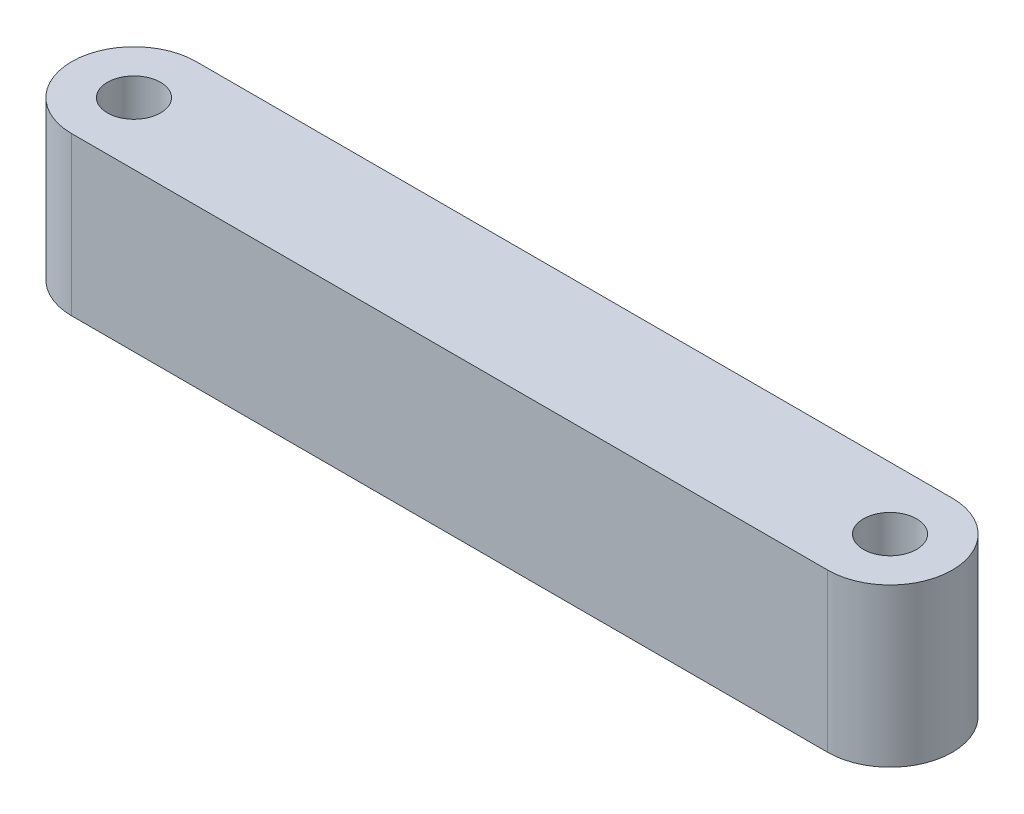
ISO-10303-21;
HEADER;
FILE_DESCRIPTION(('STEP AP214'),'2;1');
FILE_NAME('part.step','',(''),(''),'','','');
FILE_SCHEMA(('AUTOMOTIVE_DESIGN { 1 0 10303 214 1 1 1 1 }'));
ENDSEC;
DATA;
#1=APPLICATION_CONTEXT('core data for automotive mechanical design processes');
#2=APPLICATION_PROTOCOL_DEFINITION('international standard','automotive_design',2000,#1);
#3=PRODUCT_CONTEXT('',#1,'mechanical');
#4=PRODUCT('Part','Part','',(#3));
#5=PRODUCT_RELATED_PRODUCT_CATEGORY('part','',(#4));
#6=PRODUCT_DEFINITION_FORMATION('','',#4);
#7=PRODUCT_DEFINITION_CONTEXT('part definition',#1,'design');
#8=PRODUCT_DEFINITION('design','',#6,#7);
#9=PRODUCT_DEFINITION_SHAPE('','',#8);
#10=(LENGTH_UNIT() NAMED_UNIT(*) SI_UNIT(.MILLI.,.METRE.));
#11=(NAMED_UNIT(*) PLANE_ANGLE_UNIT() SI_UNIT($,.RADIAN.));
#12=(NAMED_UNIT(*) SI_UNIT($,.STERADIAN.) SOLID_ANGLE_UNIT());
#13=UNCERTAINTY_MEASURE_WITH_UNIT(LENGTH_MEASURE(1.E-05),#10,'distance_accuracy_value','');
#14=(GEOMETRIC_REPRESENTATION_CONTEXT(3) GLOBAL_UNCERTAINTY_ASSIGNED_CONTEXT((#13)) GLOBAL_UNIT_ASSIGNED_CONTEXT((#10,
#11,#12)) REPRESENTATION_CONTEXT('',''));
#15=CARTESIAN_POINT('',(0.,0.,0.));
#16=DIRECTION('',(0.,0.,1.));
#17=DIRECTION('',(1.,0.,0.));
#18=AXIS2_PLACEMENT_3D('',#15,#16,#17);
#19=CARTESIAN_POINT('',(-22.75,0.,0.));
#20=DIRECTION('',(0.,-1.,0.));
#21=DIRECTION('',(0.,0.,-1.));
#22=AXIS2_PLACEMENT_3D('',#19,#20,#21);
#23=CYLINDRICAL_SURFACE('',#22,3.75);
#24=DIRECTION('',(0.,-1.,0.));
#25=VECTOR('',#24,1.);
#26=CARTESIAN_POINT('',(-22.75,9.5,-3.75));
#27=LINE('',#26,#25);
#28=CARTESIAN_POINT('',(-22.75,0.,-3.75));
#29=VERTEX_POINT('',#28);
#30=CARTESIAN_POINT('',(-22.75,9.5,-3.75));
#31=VERTEX_POINT('',#30);
#32=EDGE_CURVE('E95',#29,#31,#27,.F.);
#33=ORIENTED_EDGE('',*,*,#32,.F.);
#34=CARTESIAN_POINT('',(-22.75,0.,0.));
#35=DIRECTION('',(0.,-1.,0.));
#36=DIRECTION('',(0.,0.,-1.));
#37=AXIS2_PLACEMENT_3D('',#34,#35,#36);
#38=CIRCLE('',#37,3.75);
#39=CARTESIAN_POINT('',(-22.75,0.,3.75));
#40=VERTEX_POINT('',#39);
#41=EDGE_CURVE('E52',#40,#29,#38,.T.);
#42=ORIENTED_EDGE('',*,*,#41,.F.);
#43=DIRECTION('',(0.,-1.,0.));
#44=VECTOR('',#43,1.);
#45=CARTESIAN_POINT('',(-22.75,9.5,3.75));
#46=LINE('',#45,#44);
#47=CARTESIAN_POINT('',(-22.75,9.5,3.75));
#48=VERTEX_POINT('',#47);
#49=EDGE_CURVE('E127',#48,#40,#46,.T.);
#50=ORIENTED_EDGE('',*,*,#49,.F.);
#51=CARTESIAN_POINT('',(-22.75,9.5,0.));
#52=DIRECTION('',(0.,-1.,0.));
#53=DIRECTION('',(0.,0.,-1.));
#54=AXIS2_PLACEMENT_3D('',#51,#52,#53);
#55=CIRCLE('',#54,3.75);
#56=EDGE_CURVE('E11',#31,#48,#55,.F.);
#57=ORIENTED_EDGE('',*,*,#56,.F.);
#58=EDGE_LOOP('',(#33,#42,#50,#57));
#59=FACE_BOUND('',#58,.T.);
#60=ADVANCED_FACE('F43',(#59),#23,.T.);
#61=CARTESIAN_POINT('',(22.75,9.5,0.));
#62=DIRECTION('',(0.,-1.,0.));
#63=DIRECTION('',(0.,0.,-1.));
#64=AXIS2_PLACEMENT_3D('',#61,#62,#63);
#65=CYLINDRICAL_SURFACE('',#64,3.75);
#66=DIRECTION('',(0.,-1.,0.));
#67=VECTOR('',#66,1.);
#68=CARTESIAN_POINT('',(22.75,9.5,-3.75));
#69=LINE('',#68,#67);
#70=CARTESIAN_POINT('',(22.75,9.5,-3.75));
#71=VERTEX_POINT('',#70);
#72=CARTESIAN_POINT('',(22.75,0.,-3.75));
#73=VERTEX_POINT('',#72);
#74=EDGE_CURVE('E87',#71,#73,#69,.T.);
#75=ORIENTED_EDGE('',*,*,#74,.F.);
#76=CARTESIAN_POINT('',(22.75,9.5,0.));
#77=DIRECTION('',(0.,-1.,0.));
#78=DIRECTION('',(0.,0.,-1.));
#79=AXIS2_PLACEMENT_3D('',#76,#77,#78);
#80=CIRCLE('',#79,3.75);
#81=CARTESIAN_POINT('',(22.75,9.5,3.75));
#82=VERTEX_POINT('',#81);
#83=EDGE_CURVE('E96',#82,#71,#80,.F.);
#84=ORIENTED_EDGE('',*,*,#83,.F.);
#85=DIRECTION('',(0.,-1.,0.));
#86=VECTOR('',#85,1.);
#87=CARTESIAN_POINT('',(22.75,9.5,3.75));
#88=LINE('',#87,#86);
#89=CARTESIAN_POINT('',(22.75,0.,3.75));
#90=VERTEX_POINT('',#89);
#91=EDGE_CURVE('E90',#90,#82,#88,.F.);
#92=ORIENTED_EDGE('',*,*,#91,.F.);
#93=CARTESIAN_POINT('',(22.75,0.,0.));
#94=DIRECTION('',(0.,-1.,0.));
#95=DIRECTION('',(0.,0.,-1.));
#96=AXIS2_PLACEMENT_3D('',#93,#94,#95);
#97=CIRCLE('',#96,3.75);
#98=EDGE_CURVE('E83',#73,#90,#97,.T.);
#99=ORIENTED_EDGE('',*,*,#98,.F.);
#100=EDGE_LOOP('',(#75,#84,#92,#99));
#101=FACE_BOUND('',#100,.T.);
#102=ADVANCED_FACE('F85',(#101),#65,.T.);
#103=CARTESIAN_POINT('',(-26.5,9.5,-3.75));
#104=DIRECTION('',(0.,0.,1.));
#105=DIRECTION('',(1.,0.,0.));
#106=AXIS2_PLACEMENT_3D('',#103,#104,#105);
#107=PLANE('',#106);
#108=DIRECTION('',(-1.,0.,0.));
#109=VECTOR('',#108,1.);
#110=CARTESIAN_POINT('',(-26.5,0.,-3.75));
#111=LINE('',#110,#109);
#112=EDGE_CURVE('E102',#73,#29,#111,.T.);
#113=ORIENTED_EDGE('',*,*,#112,.T.);
#114=ORIENTED_EDGE('',*,*,#32,.T.);
#115=DIRECTION('',(-1.,0.,0.));
#116=VECTOR('',#115,1.);
#117=CARTESIAN_POINT('',(-26.5,9.5,-3.75));
#118=LINE('',#117,#116);
#119=EDGE_CURVE('E103',#71,#31,#118,.T.);
#120=ORIENTED_EDGE('',*,*,#119,.F.);
#121=ORIENTED_EDGE('',*,*,#74,.T.);
#122=EDGE_LOOP('',(#113,#114,#120,#121));
#123=FACE_BOUND('',#122,.T.);
#124=ADVANCED_FACE('F100',(#123),#107,.F.);
#125=CARTESIAN_POINT('',(-26.5,9.5,3.75));
#126=DIRECTION('',(0.,0.,-1.));
#127=DIRECTION('',(-1.,0.,0.));
#128=AXIS2_PLACEMENT_3D('',#125,#126,#127);
#129=PLANE('',#128);
#130=DIRECTION('',(1.,0.,0.));
#131=VECTOR('',#130,1.);
#132=CARTESIAN_POINT('',(-26.5,9.5,3.75));
#133=LINE('',#132,#131);
#134=EDGE_CURVE('E105',#48,#82,#133,.T.);
#135=ORIENTED_EDGE('',*,*,#134,.F.);
#136=ORIENTED_EDGE('',*,*,#49,.T.);
#137=DIRECTION('',(1.,0.,0.));
#138=VECTOR('',#137,1.);
#139=CARTESIAN_POINT('',(-26.5,0.,3.75));
#140=LINE('',#139,#138);
#141=EDGE_CURVE('E109',#40,#90,#140,.T.);
#142=ORIENTED_EDGE('',*,*,#141,.T.);
#143=ORIENTED_EDGE('',*,*,#91,.T.);
#144=EDGE_LOOP('',(#135,#136,#142,#143));
#145=FACE_BOUND('',#144,.T.);
#146=ADVANCED_FACE('F150',(#145),#129,.F.);
#147=CARTESIAN_POINT('',(0.,9.5,0.));
#148=DIRECTION('',(0.,-1.,0.));
#149=DIRECTION('',(0.,0.,-1.));
#150=AXIS2_PLACEMENT_3D('',#147,#148,#149);
#151=PLANE('',#150);
#152=CARTESIAN_POINT('',(-22.75,9.5,0.));
#153=DIRECTION('',(0.,1.,0.));
#154=DIRECTION('',(0.,0.,1.));
#155=AXIS2_PLACEMENT_3D('',#152,#153,#154);
#156=CIRCLE('',#155,1.60000000000001);
#157=CARTESIAN_POINT('',(-22.75,9.5,1.60000000000001));
#158=VERTEX_POINT('',#157);
#159=EDGE_CURVE('E116',#158,#158,#156,.T.);
#160=ORIENTED_EDGE('',*,*,#159,.F.);
#161=EDGE_LOOP('',(#160));
#162=FACE_BOUND('',#161,.T.);
#163=CARTESIAN_POINT('',(22.75,9.5,0.));
#164=DIRECTION('',(0.,1.,0.));
#165=DIRECTION('',(0.,0.,1.));
#166=AXIS2_PLACEMENT_3D('',#163,#164,#165);
#167=CIRCLE('',#166,1.60000000000001);
#168=CARTESIAN_POINT('',(22.75,9.5,1.60000000000001));
#169=VERTEX_POINT('',#168);
#170=EDGE_CURVE('E133',#169,#169,#167,.T.);
#171=ORIENTED_EDGE('',*,*,#170,.F.);
#172=EDGE_LOOP('',(#171));
#173=FACE_BOUND('',#172,.T.);
#174=ORIENTED_EDGE('',*,*,#119,.T.);
#175=ORIENTED_EDGE('',*,*,#56,.T.);
#176=ORIENTED_EDGE('',*,*,#134,.T.);
#177=ORIENTED_EDGE('',*,*,#83,.T.);
#178=EDGE_LOOP('',(#174,#175,#176,#177));
#179=FACE_BOUND('',#178,.T.);
#180=ADVANCED_FACE('F147',(#162,#173,#179),#151,.F.);
#181=CARTESIAN_POINT('',(0.,0.,0.));
#182=DIRECTION('',(0.,-1.,0.));
#183=DIRECTION('',(0.,0.,-1.));
#184=AXIS2_PLACEMENT_3D('',#181,#182,#183);
#185=PLANE('',#184);
#186=CARTESIAN_POINT('',(-22.75,0.,0.));
#187=DIRECTION('',(0.,1.,0.));
#188=DIRECTION('',(0.,0.,1.));
#189=AXIS2_PLACEMENT_3D('',#186,#187,#188);
#190=CIRCLE('',#189,1.60000000000001);
#191=CARTESIAN_POINT('',(-22.75,0.,1.60000000000001));
#192=VERTEX_POINT('',#191);
#193=EDGE_CURVE('E110',#192,#192,#190,.T.);
#194=ORIENTED_EDGE('',*,*,#193,.T.);
#195=EDGE_LOOP('',(#194));
#196=FACE_BOUND('',#195,.T.);
#197=CARTESIAN_POINT('',(22.75,0.,0.));
#198=DIRECTION('',(0.,1.,0.));
#199=DIRECTION('',(0.,0.,1.));
#200=AXIS2_PLACEMENT_3D('',#197,#198,#199);
#201=CIRCLE('',#200,1.60000000000001);
#202=CARTESIAN_POINT('',(22.75,0.,1.60000000000001));
#203=VERTEX_POINT('',#202);
#204=EDGE_CURVE('E137',#203,#203,#201,.T.);
#205=ORIENTED_EDGE('',*,*,#204,.T.);
#206=EDGE_LOOP('',(#205));
#207=FACE_BOUND('',#206,.T.);
#208=ORIENTED_EDGE('',*,*,#141,.F.);
#209=ORIENTED_EDGE('',*,*,#41,.T.);
#210=ORIENTED_EDGE('',*,*,#112,.F.);
#211=ORIENTED_EDGE('',*,*,#98,.T.);
#212=EDGE_LOOP('',(#208,#209,#210,#211));
#213=FACE_BOUND('',#212,.T.);
#214=ADVANCED_FACE('F107',(#196,#207,#213),#185,.T.);
#215=CARTESIAN_POINT('',(22.75,0.,0.));
#216=DIRECTION('',(0.,1.,0.));
#217=DIRECTION('',(0.,0.,1.));
#218=AXIS2_PLACEMENT_3D('',#215,#216,#217);
#219=CYLINDRICAL_SURFACE('',#218,1.60000000000001);
#220=ORIENTED_EDGE('',*,*,#204,.F.);
#221=EDGE_LOOP('',(#220));
#222=FACE_BOUND('',#221,.T.);
#223=ORIENTED_EDGE('',*,*,#170,.T.);
#224=EDGE_LOOP('',(#223));
#225=FACE_BOUND('',#224,.T.);
#226=ADVANCED_FACE('F154',(#222,#225),#219,.F.);
#227=CARTESIAN_POINT('',(-22.75,0.,0.));
#228=DIRECTION('',(0.,1.,0.));
#229=DIRECTION('',(0.,0.,1.));
#230=AXIS2_PLACEMENT_3D('',#227,#228,#229);
#231=CYLINDRICAL_SURFACE('',#230,1.60000000000001);
#232=ORIENTED_EDGE('',*,*,#193,.F.);
#233=EDGE_LOOP('',(#232));
#234=FACE_BOUND('',#233,.T.);
#235=ORIENTED_EDGE('',*,*,#159,.T.);
#236=EDGE_LOOP('',(#235));
#237=FACE_BOUND('',#236,.T.);
#238=ADVANCED_FACE('F145',(#234,#237),#231,.F.);
#239=CLOSED_SHELL('',(#60,#102,#124,#146,#180,#214,#226,#238));
#240=MANIFOLD_SOLID_BREP('B2',#239);
#241=ADVANCED_BREP_SHAPE_REPRESENTATION('',(#18,#240),#14);
#242=SHAPE_DEFINITION_REPRESENTATION(#9,#241);
ENDSEC;
END-ISO-10303-21;
